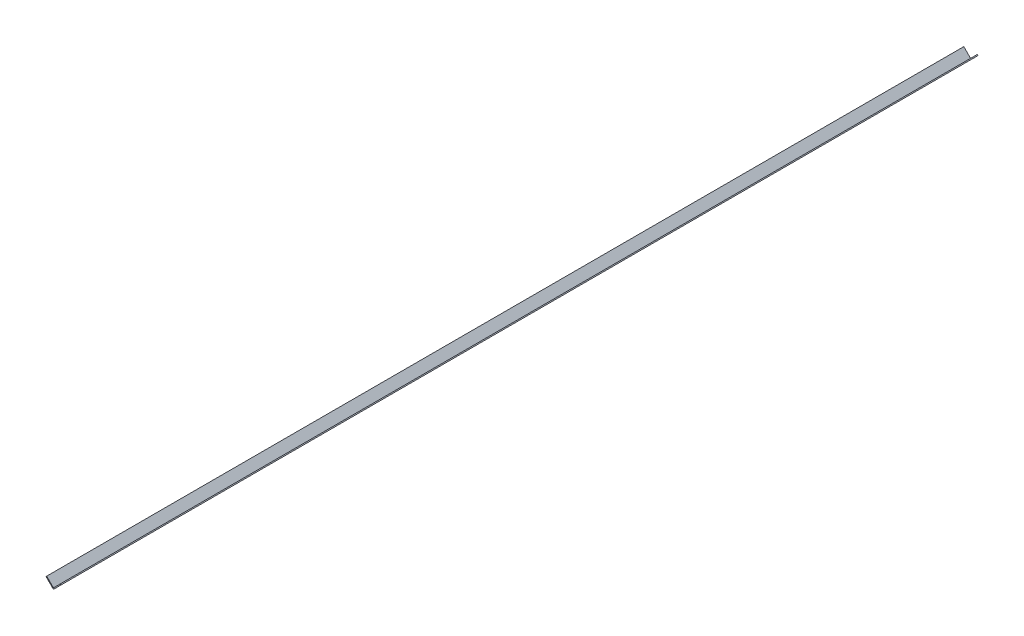
ISO-10303-21;
HEADER;
FILE_DESCRIPTION(('STEP AP214'),'2;1');
FILE_NAME('part.step','',(''),(''),'','','');
FILE_SCHEMA(('AUTOMOTIVE_DESIGN { 1 0 10303 214 1 1 1 1 }'));
ENDSEC;
DATA;
#1=APPLICATION_CONTEXT('core data for automotive mechanical design processes');
#2=APPLICATION_PROTOCOL_DEFINITION('international standard','automotive_design',2000,#1);
#3=PRODUCT_CONTEXT('',#1,'mechanical');
#4=PRODUCT('Part','Part','',(#3));
#5=PRODUCT_RELATED_PRODUCT_CATEGORY('part','',(#4));
#6=PRODUCT_DEFINITION_FORMATION('','',#4);
#7=PRODUCT_DEFINITION_CONTEXT('part definition',#1,'design');
#8=PRODUCT_DEFINITION('design','',#6,#7);
#9=PRODUCT_DEFINITION_SHAPE('','',#8);
#10=(LENGTH_UNIT() NAMED_UNIT(*) SI_UNIT(.MILLI.,.METRE.));
#11=(NAMED_UNIT(*) PLANE_ANGLE_UNIT() SI_UNIT($,.RADIAN.));
#12=(NAMED_UNIT(*) SI_UNIT($,.STERADIAN.) SOLID_ANGLE_UNIT());
#13=UNCERTAINTY_MEASURE_WITH_UNIT(LENGTH_MEASURE(1.E-05),#10,'distance_accuracy_value','');
#14=(GEOMETRIC_REPRESENTATION_CONTEXT(3) GLOBAL_UNCERTAINTY_ASSIGNED_CONTEXT((#13)) GLOBAL_UNIT_ASSIGNED_CONTEXT((#10,
#11,#12)) REPRESENTATION_CONTEXT('',''));
#15=CARTESIAN_POINT('',(0.,0.,0.));
#16=DIRECTION('',(0.,0.,1.));
#17=DIRECTION('',(1.,0.,0.));
#18=AXIS2_PLACEMENT_3D('',#15,#16,#17);
#19=CARTESIAN_POINT('',(8.98025612106916,8.98025612106915,-76.2));
#20=DIRECTION('',(-0.707106781186547,0.707106781186548,0.));
#21=DIRECTION('',(-0.707106781186548,-0.707106781186547,0.));
#22=AXIS2_PLACEMENT_3D('',#19,#20,#21);
#23=PLANE('',#22);
#24=DIRECTION('',(0.,0.,1.));
#25=VECTOR('',#24,1.);
#26=CARTESIAN_POINT('',(0.,0.,-76.2));
#27=LINE('',#26,#25);
#28=CARTESIAN_POINT('',(0.,0.,-76.2));
#29=VERTEX_POINT('',#28);
#30=CARTESIAN_POINT('',(0.,0.,1143.));
#31=VERTEX_POINT('',#30);
#32=EDGE_CURVE('E42',#29,#31,#27,.T.);
#33=ORIENTED_EDGE('',*,*,#32,.T.);
#34=DIRECTION('',(-0.707106781186548,-0.707106781186547,0.));
#35=VECTOR('',#34,1.);
#36=CARTESIAN_POINT('',(8.98025612106916,8.98025612106915,1143.));
#37=LINE('',#36,#35);
#38=CARTESIAN_POINT('',(8.98025612106916,8.98025612106915,1143.));
#39=VERTEX_POINT('',#38);
#40=EDGE_CURVE('E92',#39,#31,#37,.T.);
#41=ORIENTED_EDGE('',*,*,#40,.F.);
#42=DIRECTION('',(0.,0.,1.));
#43=VECTOR('',#42,1.);
#44=CARTESIAN_POINT('',(8.98025612106916,8.98025612106915,-76.2));
#45=LINE('',#44,#43);
#46=CARTESIAN_POINT('',(8.98025612106916,8.98025612106915,-76.2));
#47=VERTEX_POINT('',#46);
#48=EDGE_CURVE('E11',#47,#39,#45,.T.);
#49=ORIENTED_EDGE('',*,*,#48,.F.);
#50=DIRECTION('',(-0.707106781186548,-0.707106781186547,0.));
#51=VECTOR('',#50,1.);
#52=CARTESIAN_POINT('',(8.98025612106916,8.98025612106915,-76.2));
#53=LINE('',#52,#51);
#54=EDGE_CURVE('E93',#47,#29,#53,.T.);
#55=ORIENTED_EDGE('',*,*,#54,.T.);
#56=EDGE_LOOP('',(#33,#41,#49,#55));
#57=FACE_BOUND('',#56,.T.);
#58=ADVANCED_FACE('F39',(#57),#23,.T.);
#59=CARTESIAN_POINT('',(9.87828173317607,8.08223050896223,-76.2));
#60=DIRECTION('',(0.707106781186548,0.707106781186547,0.));
#61=DIRECTION('',(-0.707106781186547,0.707106781186548,0.));
#62=AXIS2_PLACEMENT_3D('',#59,#60,#61);
#63=PLANE('',#62);
#64=ORIENTED_EDGE('',*,*,#48,.T.);
#65=DIRECTION('',(-0.707106781186547,0.707106781186548,0.));
#66=VECTOR('',#65,1.);
#67=CARTESIAN_POINT('',(9.87828173317607,8.08223050896223,1143.));
#68=LINE('',#67,#66);
#69=CARTESIAN_POINT('',(9.87828173317607,8.08223050896223,1143.));
#70=VERTEX_POINT('',#69);
#71=EDGE_CURVE('E112',#70,#39,#68,.T.);
#72=ORIENTED_EDGE('',*,*,#71,.F.);
#73=DIRECTION('',(0.,0.,1.));
#74=VECTOR('',#73,1.);
#75=CARTESIAN_POINT('',(9.87828173317607,8.08223050896223,-76.2));
#76=LINE('',#75,#74);
#77=CARTESIAN_POINT('',(9.87828173317607,8.08223050896223,-76.2));
#78=VERTEX_POINT('',#77);
#79=EDGE_CURVE('E48',#78,#70,#76,.T.);
#80=ORIENTED_EDGE('',*,*,#79,.F.);
#81=DIRECTION('',(-0.707106781186547,0.707106781186548,0.));
#82=VECTOR('',#81,1.);
#83=CARTESIAN_POINT('',(9.87828173317607,8.08223050896223,-76.2));
#84=LINE('',#83,#82);
#85=EDGE_CURVE('E99',#78,#47,#84,.T.);
#86=ORIENTED_EDGE('',*,*,#85,.T.);
#87=EDGE_LOOP('',(#64,#72,#80,#86));
#88=FACE_BOUND('',#87,.T.);
#89=ADVANCED_FACE('F167',(#88),#63,.T.);
#90=CARTESIAN_POINT('',(0.,-1.79605122421383,-76.2));
#91=DIRECTION('',(0.707106781186547,-0.707106781186548,0.));
#92=DIRECTION('',(0.707106781186548,0.707106781186547,0.));
#93=AXIS2_PLACEMENT_3D('',#90,#91,#92);
#94=PLANE('',#93);
#95=ORIENTED_EDGE('',*,*,#79,.T.);
#96=DIRECTION('',(0.707106781186548,0.707106781186547,0.));
#97=VECTOR('',#96,1.);
#98=CARTESIAN_POINT('',(0.,-1.79605122421383,1143.));
#99=LINE('',#98,#97);
#100=CARTESIAN_POINT('',(0.,-1.79605122421383,1143.));
#101=VERTEX_POINT('',#100);
#102=EDGE_CURVE('E122',#101,#70,#99,.T.);
#103=ORIENTED_EDGE('',*,*,#102,.F.);
#104=DIRECTION('',(0.,0.,1.));
#105=VECTOR('',#104,1.);
#106=CARTESIAN_POINT('',(0.,-1.79605122421383,-76.2));
#107=LINE('',#106,#105);
#108=CARTESIAN_POINT('',(0.,-1.79605122421383,-76.2));
#109=VERTEX_POINT('',#108);
#110=EDGE_CURVE('E147',#109,#101,#107,.T.);
#111=ORIENTED_EDGE('',*,*,#110,.F.);
#112=DIRECTION('',(0.707106781186548,0.707106781186547,0.));
#113=VECTOR('',#112,1.);
#114=CARTESIAN_POINT('',(0.,-1.79605122421383,-76.2));
#115=LINE('',#114,#113);
#116=EDGE_CURVE('E140',#109,#78,#115,.T.);
#117=ORIENTED_EDGE('',*,*,#116,.T.);
#118=EDGE_LOOP('',(#95,#103,#111,#117));
#119=FACE_BOUND('',#118,.T.);
#120=ADVANCED_FACE('F163',(#119),#94,.T.);
#121=CARTESIAN_POINT('',(-9.87828173317606,8.08223050896225,-76.2));
#122=DIRECTION('',(-0.707106781186548,-0.707106781186547,0.));
#123=DIRECTION('',(0.707106781186547,-0.707106781186548,0.));
#124=AXIS2_PLACEMENT_3D('',#121,#122,#123);
#125=PLANE('',#124);
#126=ORIENTED_EDGE('',*,*,#110,.T.);
#127=DIRECTION('',(0.707106781186547,-0.707106781186548,0.));
#128=VECTOR('',#127,1.);
#129=CARTESIAN_POINT('',(-9.87828173317606,8.08223050896225,1143.));
#130=LINE('',#129,#128);
#131=CARTESIAN_POINT('',(-9.87828173317606,8.08223050896225,1143.));
#132=VERTEX_POINT('',#131);
#133=EDGE_CURVE('E118',#132,#101,#130,.T.);
#134=ORIENTED_EDGE('',*,*,#133,.F.);
#135=DIRECTION('',(0.,0.,1.));
#136=VECTOR('',#135,1.);
#137=CARTESIAN_POINT('',(-9.87828173317606,8.08223050896225,-76.2));
#138=LINE('',#137,#136);
#139=CARTESIAN_POINT('',(-9.87828173317606,8.08223050896225,-76.2));
#140=VERTEX_POINT('',#139);
#141=EDGE_CURVE('E150',#140,#132,#138,.T.);
#142=ORIENTED_EDGE('',*,*,#141,.F.);
#143=DIRECTION('',(0.707106781186547,-0.707106781186548,0.));
#144=VECTOR('',#143,1.);
#145=CARTESIAN_POINT('',(-9.87828173317606,8.08223050896225,-76.2));
#146=LINE('',#145,#144);
#147=EDGE_CURVE('E136',#140,#109,#146,.T.);
#148=ORIENTED_EDGE('',*,*,#147,.T.);
#149=EDGE_LOOP('',(#126,#134,#142,#148));
#150=FACE_BOUND('',#149,.T.);
#151=ADVANCED_FACE('F160',(#150),#125,.T.);
#152=CARTESIAN_POINT('',(-8.98025612106914,8.98025612106916,-76.2));
#153=DIRECTION('',(-0.707106781186547,0.707106781186548,0.));
#154=DIRECTION('',(-0.707106781186548,-0.707106781186547,0.));
#155=AXIS2_PLACEMENT_3D('',#152,#153,#154);
#156=PLANE('',#155);
#157=ORIENTED_EDGE('',*,*,#141,.T.);
#158=DIRECTION('',(-0.707106781186548,-0.707106781186547,0.));
#159=VECTOR('',#158,1.);
#160=CARTESIAN_POINT('',(-8.98025612106914,8.98025612106916,1143.));
#161=LINE('',#160,#159);
#162=CARTESIAN_POINT('',(-8.98025612106914,8.98025612106916,1143.));
#163=VERTEX_POINT('',#162);
#164=EDGE_CURVE('E107',#163,#132,#161,.T.);
#165=ORIENTED_EDGE('',*,*,#164,.F.);
#166=DIRECTION('',(0.,0.,1.));
#167=VECTOR('',#166,1.);
#168=CARTESIAN_POINT('',(-8.98025612106914,8.98025612106916,-76.2));
#169=LINE('',#168,#167);
#170=CARTESIAN_POINT('',(-8.98025612106914,8.98025612106916,-76.2));
#171=VERTEX_POINT('',#170);
#172=EDGE_CURVE('E98',#171,#163,#169,.T.);
#173=ORIENTED_EDGE('',*,*,#172,.F.);
#174=DIRECTION('',(-0.707106781186548,-0.707106781186547,0.));
#175=VECTOR('',#174,1.);
#176=CARTESIAN_POINT('',(-8.98025612106914,8.98025612106916,-76.2));
#177=LINE('',#176,#175);
#178=EDGE_CURVE('E132',#171,#140,#177,.T.);
#179=ORIENTED_EDGE('',*,*,#178,.T.);
#180=EDGE_LOOP('',(#157,#165,#173,#179));
#181=FACE_BOUND('',#180,.T.);
#182=ADVANCED_FACE('F154',(#181),#156,.T.);
#183=CARTESIAN_POINT('',(0.,0.,-76.2));
#184=DIRECTION('',(0.707106781186548,0.707106781186547,0.));
#185=DIRECTION('',(-0.707106781186547,0.707106781186548,0.));
#186=AXIS2_PLACEMENT_3D('',#183,#184,#185);
#187=PLANE('',#186);
#188=ORIENTED_EDGE('',*,*,#172,.T.);
#189=DIRECTION('',(-0.707106781186547,0.707106781186548,0.));
#190=VECTOR('',#189,1.);
#191=CARTESIAN_POINT('',(0.,0.,1143.));
#192=LINE('',#191,#190);
#193=EDGE_CURVE('E101',#31,#163,#192,.T.);
#194=ORIENTED_EDGE('',*,*,#193,.F.);
#195=ORIENTED_EDGE('',*,*,#32,.F.);
#196=DIRECTION('',(-0.707106781186547,0.707106781186548,0.));
#197=VECTOR('',#196,1.);
#198=CARTESIAN_POINT('',(0.,0.,-76.2));
#199=LINE('',#198,#197);
#200=EDGE_CURVE('E129',#29,#171,#199,.T.);
#201=ORIENTED_EDGE('',*,*,#200,.T.);
#202=EDGE_LOOP('',(#188,#194,#195,#201));
#203=FACE_BOUND('',#202,.T.);
#204=ADVANCED_FACE('F102',(#203),#187,.T.);
#205=CARTESIAN_POINT('',(0.,0.,-76.2));
#206=DIRECTION('',(0.,0.,-1.));
#207=DIRECTION('',(-1.,0.,0.));
#208=AXIS2_PLACEMENT_3D('',#205,#206,#207);
#209=PLANE('',#208);
#210=ORIENTED_EDGE('',*,*,#54,.F.);
#211=ORIENTED_EDGE('',*,*,#85,.F.);
#212=ORIENTED_EDGE('',*,*,#116,.F.);
#213=ORIENTED_EDGE('',*,*,#147,.F.);
#214=ORIENTED_EDGE('',*,*,#178,.F.);
#215=ORIENTED_EDGE('',*,*,#200,.F.);
#216=EDGE_LOOP('',(#210,#211,#212,#213,#214,#215));
#217=FACE_BOUND('',#216,.T.);
#218=ADVANCED_FACE('F166',(#217),#209,.T.);
#219=CARTESIAN_POINT('',(0.,0.,1143.));
#220=DIRECTION('',(0.,0.,-1.));
#221=DIRECTION('',(-1.,0.,0.));
#222=AXIS2_PLACEMENT_3D('',#219,#220,#221);
#223=PLANE('',#222);
#224=ORIENTED_EDGE('',*,*,#40,.T.);
#225=ORIENTED_EDGE('',*,*,#193,.T.);
#226=ORIENTED_EDGE('',*,*,#164,.T.);
#227=ORIENTED_EDGE('',*,*,#133,.T.);
#228=ORIENTED_EDGE('',*,*,#102,.T.);
#229=ORIENTED_EDGE('',*,*,#71,.T.);
#230=EDGE_LOOP('',(#224,#225,#226,#227,#228,#229));
#231=FACE_BOUND('',#230,.T.);
#232=ADVANCED_FACE('F110',(#231),#223,.F.);
#233=CLOSED_SHELL('',(#58,#89,#120,#151,#182,#204,#218,#232));
#234=MANIFOLD_SOLID_BREP('B2',#233);
#235=ADVANCED_BREP_SHAPE_REPRESENTATION('',(#18,#234),#14);
#236=SHAPE_DEFINITION_REPRESENTATION(#9,#235);
ENDSEC;
END-ISO-10303-21;
